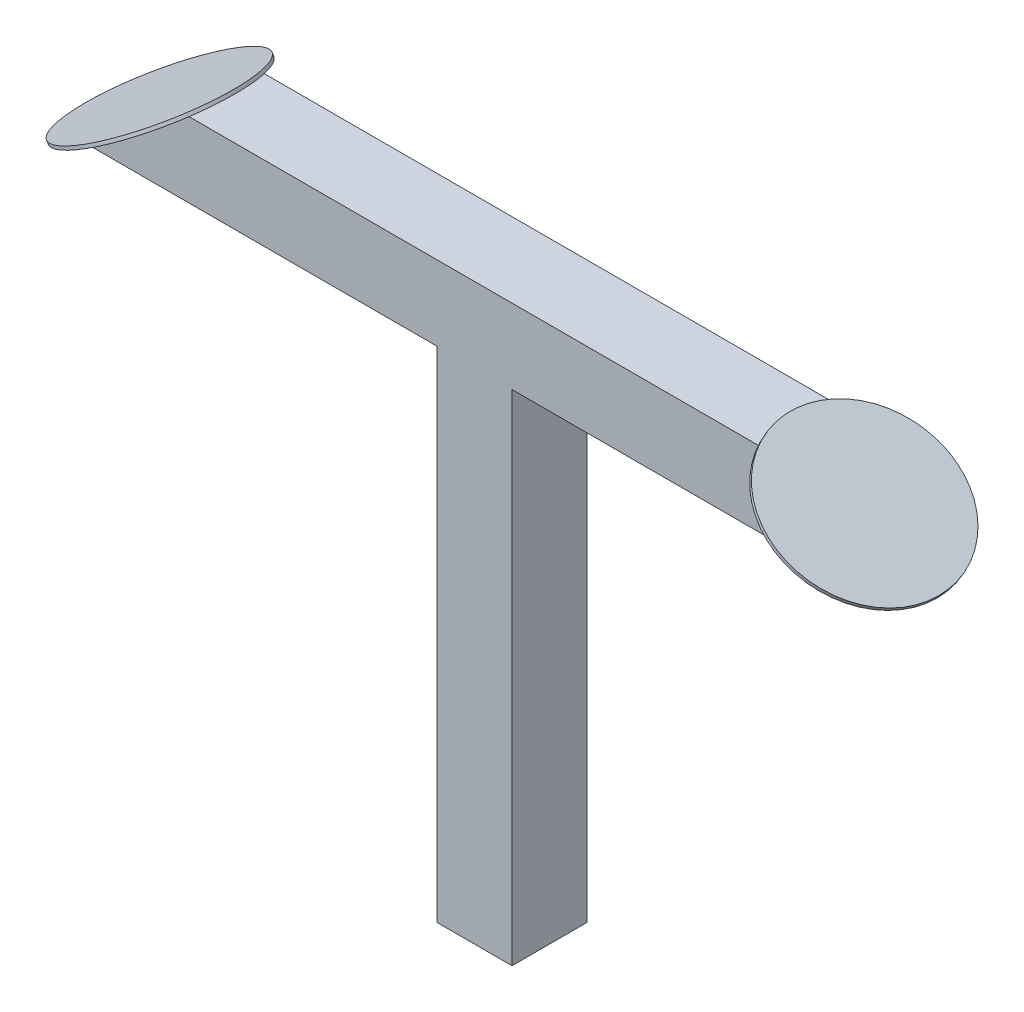
ISO-10303-21;
HEADER;
FILE_DESCRIPTION(('STEP AP214'),'2;1');
FILE_NAME('part.step','',(''),(''),'','','');
FILE_SCHEMA(('AUTOMOTIVE_DESIGN { 1 0 10303 214 1 1 1 1 }'));
ENDSEC;
DATA;
#1=APPLICATION_CONTEXT('core data for automotive mechanical design processes');
#2=APPLICATION_PROTOCOL_DEFINITION('international standard','automotive_design',2000,#1);
#3=PRODUCT_CONTEXT('',#1,'mechanical');
#4=PRODUCT('Part','Part','',(#3));
#5=PRODUCT_RELATED_PRODUCT_CATEGORY('part','',(#4));
#6=PRODUCT_DEFINITION_FORMATION('','',#4);
#7=PRODUCT_DEFINITION_CONTEXT('part definition',#1,'design');
#8=PRODUCT_DEFINITION('design','',#6,#7);
#9=PRODUCT_DEFINITION_SHAPE('','',#8);
#10=(LENGTH_UNIT() NAMED_UNIT(*) SI_UNIT(.MILLI.,.METRE.));
#11=(NAMED_UNIT(*) PLANE_ANGLE_UNIT() SI_UNIT($,.RADIAN.));
#12=(NAMED_UNIT(*) SI_UNIT($,.STERADIAN.) SOLID_ANGLE_UNIT());
#13=UNCERTAINTY_MEASURE_WITH_UNIT(LENGTH_MEASURE(1.E-05),#10,'distance_accuracy_value','');
#14=(GEOMETRIC_REPRESENTATION_CONTEXT(3) GLOBAL_UNCERTAINTY_ASSIGNED_CONTEXT((#13)) GLOBAL_UNIT_ASSIGNED_CONTEXT((#10,
#11,#12)) REPRESENTATION_CONTEXT('',''));
#15=CARTESIAN_POINT('',(0.,0.,0.));
#16=DIRECTION('',(0.,0.,1.));
#17=DIRECTION('',(1.,0.,0.));
#18=AXIS2_PLACEMENT_3D('',#15,#16,#17);
#19=CARTESIAN_POINT('',(-22.5,300.,-22.5));
#20=DIRECTION('',(0.,0.,1.));
#21=DIRECTION('',(1.,0.,0.));
#22=AXIS2_PLACEMENT_3D('',#19,#20,#21);
#23=PLANE('',#22);
#24=DIRECTION('',(-0.866025403784437,0.500000000000002,0.));
#25=VECTOR('',#24,1.);
#26=CARTESIAN_POINT('',(250.000000000001,300.,-22.5));
#27=LINE('',#26,#25);
#28=CARTESIAN_POINT('',(250.000000000001,300.,-22.5));
#29=VERTEX_POINT('',#28);
#30=CARTESIAN_POINT('',(172.057713659402,345.,-22.5));
#31=VERTEX_POINT('',#30);
#32=EDGE_CURVE('E336',#29,#31,#27,.T.);
#33=ORIENTED_EDGE('',*,*,#32,.F.);
#34=DIRECTION('',(-1.,0.,0.));
#35=VECTOR('',#34,1.);
#36=CARTESIAN_POINT('',(-250.000000000001,300.,-22.5));
#37=LINE('',#36,#35);
#38=CARTESIAN_POINT('',(22.5,300.,-22.5));
#39=VERTEX_POINT('',#38);
#40=EDGE_CURVE('E235',#29,#39,#37,.T.);
#41=ORIENTED_EDGE('',*,*,#40,.T.);
#42=DIRECTION('',(0.,-1.,0.));
#43=VECTOR('',#42,1.);
#44=CARTESIAN_POINT('',(22.5,300.,-22.5));
#45=LINE('',#44,#43);
#46=CARTESIAN_POINT('',(22.5,0.,-22.5));
#47=VERTEX_POINT('',#46);
#48=EDGE_CURVE('E279',#39,#47,#45,.T.);
#49=ORIENTED_EDGE('',*,*,#48,.T.);
#50=DIRECTION('',(-1.,0.,0.));
#51=VECTOR('',#50,1.);
#52=CARTESIAN_POINT('',(-22.5,0.,-22.5));
#53=LINE('',#52,#51);
#54=CARTESIAN_POINT('',(-22.5,0.,-22.5));
#55=VERTEX_POINT('',#54);
#56=EDGE_CURVE('E260',#47,#55,#53,.T.);
#57=ORIENTED_EDGE('',*,*,#56,.T.);
#58=DIRECTION('',(0.,-1.,0.));
#59=VECTOR('',#58,1.);
#60=CARTESIAN_POINT('',(-22.5,300.,-22.5));
#61=LINE('',#60,#59);
#62=CARTESIAN_POINT('',(-22.5,300.,-22.5));
#63=VERTEX_POINT('',#62);
#64=EDGE_CURVE('E275',#63,#55,#61,.T.);
#65=ORIENTED_EDGE('',*,*,#64,.F.);
#66=CARTESIAN_POINT('',(-250.000000000001,300.,-22.5));
#67=VERTEX_POINT('',#66);
#68=EDGE_CURVE('E234',#63,#67,#37,.T.);
#69=ORIENTED_EDGE('',*,*,#68,.T.);
#70=DIRECTION('',(0.866025403784437,0.500000000000002,0.));
#71=VECTOR('',#70,1.);
#72=CARTESIAN_POINT('',(-250.000000000001,300.,-22.5));
#73=LINE('',#72,#71);
#74=CARTESIAN_POINT('',(-172.057713659402,345.,-22.5));
#75=VERTEX_POINT('',#74);
#76=EDGE_CURVE('E317',#67,#75,#73,.T.);
#77=ORIENTED_EDGE('',*,*,#76,.T.);
#78=DIRECTION('',(-1.,0.,0.));
#79=VECTOR('',#78,1.);
#80=CARTESIAN_POINT('',(-250.000000000001,345.,-22.5));
#81=LINE('',#80,#79);
#82=EDGE_CURVE('E222',#31,#75,#81,.T.);
#83=ORIENTED_EDGE('',*,*,#82,.F.);
#84=EDGE_LOOP('',(#33,#41,#49,#57,#65,#69,#77,#83));
#85=FACE_BOUND('',#84,.T.);
#86=ADVANCED_FACE('F39',(#85),#23,.F.);
#87=CARTESIAN_POINT('',(-22.5,300.,22.5));
#88=DIRECTION('',(0.,0.,-1.));
#89=DIRECTION('',(-1.,0.,0.));
#90=AXIS2_PLACEMENT_3D('',#87,#88,#89);
#91=PLANE('',#90);
#92=DIRECTION('',(-0.866025403784437,0.500000000000002,0.));
#93=VECTOR('',#92,1.);
#94=CARTESIAN_POINT('',(250.000000000001,300.,22.5));
#95=LINE('',#94,#93);
#96=CARTESIAN_POINT('',(250.000000000001,300.,22.5));
#97=VERTEX_POINT('',#96);
#98=CARTESIAN_POINT('',(172.057713659402,345.,22.5));
#99=VERTEX_POINT('',#98);
#100=EDGE_CURVE('E337',#97,#99,#95,.T.);
#101=ORIENTED_EDGE('',*,*,#100,.T.);
#102=DIRECTION('',(1.,0.,0.));
#103=VECTOR('',#102,1.);
#104=CARTESIAN_POINT('',(-250.000000000001,345.,22.5));
#105=LINE('',#104,#103);
#106=CARTESIAN_POINT('',(-172.057713659402,345.,22.5));
#107=VERTEX_POINT('',#106);
#108=EDGE_CURVE('E225',#107,#99,#105,.T.);
#109=ORIENTED_EDGE('',*,*,#108,.F.);
#110=DIRECTION('',(0.866025403784437,0.500000000000002,0.));
#111=VECTOR('',#110,1.);
#112=CARTESIAN_POINT('',(-250.000000000001,300.,22.5));
#113=LINE('',#112,#111);
#114=CARTESIAN_POINT('',(-250.000000000001,300.,22.5));
#115=VERTEX_POINT('',#114);
#116=EDGE_CURVE('E318',#115,#107,#113,.T.);
#117=ORIENTED_EDGE('',*,*,#116,.F.);
#118=DIRECTION('',(1.,0.,0.));
#119=VECTOR('',#118,1.);
#120=CARTESIAN_POINT('',(-250.000000000001,300.,22.5));
#121=LINE('',#120,#119);
#122=CARTESIAN_POINT('',(-22.5,300.,22.5));
#123=VERTEX_POINT('',#122);
#124=EDGE_CURVE('E226',#115,#123,#121,.T.);
#125=ORIENTED_EDGE('',*,*,#124,.T.);
#126=DIRECTION('',(0.,-1.,0.));
#127=VECTOR('',#126,1.);
#128=CARTESIAN_POINT('',(-22.5,300.,22.5));
#129=LINE('',#128,#127);
#130=CARTESIAN_POINT('',(-22.5,0.,22.5));
#131=VERTEX_POINT('',#130);
#132=EDGE_CURVE('E271',#123,#131,#129,.T.);
#133=ORIENTED_EDGE('',*,*,#132,.T.);
#134=DIRECTION('',(1.,0.,0.));
#135=VECTOR('',#134,1.);
#136=CARTESIAN_POINT('',(-22.5,0.,22.5));
#137=LINE('',#136,#135);
#138=CARTESIAN_POINT('',(22.5,0.,22.5));
#139=VERTEX_POINT('',#138);
#140=EDGE_CURVE('E252',#131,#139,#137,.T.);
#141=ORIENTED_EDGE('',*,*,#140,.T.);
#142=DIRECTION('',(0.,-1.,0.));
#143=VECTOR('',#142,1.);
#144=CARTESIAN_POINT('',(22.5,300.,22.5));
#145=LINE('',#144,#143);
#146=CARTESIAN_POINT('',(22.5,300.,22.5));
#147=VERTEX_POINT('',#146);
#148=EDGE_CURVE('E256',#147,#139,#145,.T.);
#149=ORIENTED_EDGE('',*,*,#148,.F.);
#150=EDGE_CURVE('E243',#147,#97,#121,.T.);
#151=ORIENTED_EDGE('',*,*,#150,.T.);
#152=EDGE_LOOP('',(#101,#109,#117,#125,#133,#141,#149,#151));
#153=FACE_BOUND('',#152,.T.);
#154=ADVANCED_FACE('F368',(#153),#91,.F.);
#155=CARTESIAN_POINT('',(0.,345.,0.));
#156=DIRECTION('',(0.,-1.,0.));
#157=DIRECTION('',(0.,0.,-1.));
#158=AXIS2_PLACEMENT_3D('',#155,#156,#157);
#159=PLANE('',#158);
#160=DIRECTION('',(0.,0.,1.));
#161=VECTOR('',#160,1.);
#162=CARTESIAN_POINT('',(172.057713659402,345.,-22.5));
#163=LINE('',#162,#161);
#164=EDGE_CURVE('E55',#31,#99,#163,.T.);
#165=ORIENTED_EDGE('',*,*,#164,.F.);
#166=ORIENTED_EDGE('',*,*,#82,.T.);
#167=DIRECTION('',(0.,0.,1.));
#168=VECTOR('',#167,1.);
#169=CARTESIAN_POINT('',(-172.057713659402,345.,-22.5));
#170=LINE('',#169,#168);
#171=EDGE_CURVE('E312',#75,#107,#170,.T.);
#172=ORIENTED_EDGE('',*,*,#171,.T.);
#173=ORIENTED_EDGE('',*,*,#108,.T.);
#174=EDGE_LOOP('',(#165,#166,#172,#173));
#175=FACE_BOUND('',#174,.T.);
#176=ADVANCED_FACE('F373',(#175),#159,.F.);
#177=CARTESIAN_POINT('',(-22.5,300.,-17.5));
#178=DIRECTION('',(0.,0.,1.));
#179=DIRECTION('',(1.,0.,0.));
#180=AXIS2_PLACEMENT_3D('',#177,#178,#179);
#181=PLANE('',#180);
#182=DIRECTION('',(-1.,0.,0.));
#183=VECTOR('',#182,1.);
#184=CARTESIAN_POINT('',(0.,305.,-17.5));
#185=LINE('',#184,#183);
#186=CARTESIAN_POINT('',(241.339745962156,305.,-17.5));
#187=VERTEX_POINT('',#186);
#188=CARTESIAN_POINT('',(17.5,305.,-17.5));
#189=VERTEX_POINT('',#188);
#190=EDGE_CURVE('E167',#187,#189,#185,.T.);
#191=ORIENTED_EDGE('',*,*,#190,.F.);
#192=DIRECTION('',(-0.866025403784438,0.500000000000002,0.));
#193=VECTOR('',#192,1.);
#194=CARTESIAN_POINT('',(45.6250000000007,417.99596126563,-17.5));
#195=LINE('',#194,#193);
#196=CARTESIAN_POINT('',(180.717967697246,340.,-17.5));
#197=VERTEX_POINT('',#196);
#198=EDGE_CURVE('E152',#187,#197,#195,.T.);
#199=ORIENTED_EDGE('',*,*,#198,.T.);
#200=DIRECTION('',(-1.,0.,0.));
#201=VECTOR('',#200,1.);
#202=CARTESIAN_POINT('',(0.,340.,-17.5));
#203=LINE('',#202,#201);
#204=CARTESIAN_POINT('',(-180.717967697246,340.,-17.5));
#205=VERTEX_POINT('',#204);
#206=EDGE_CURVE('E189',#197,#205,#203,.T.);
#207=ORIENTED_EDGE('',*,*,#206,.T.);
#208=DIRECTION('',(0.866025403784438,0.500000000000002,0.));
#209=VECTOR('',#208,1.);
#210=CARTESIAN_POINT('',(-79.3750000000006,398.51038968048,-17.5));
#211=LINE('',#210,#209);
#212=CARTESIAN_POINT('',(-241.339745962156,305.,-17.5));
#213=VERTEX_POINT('',#212);
#214=EDGE_CURVE('E298',#213,#205,#211,.T.);
#215=ORIENTED_EDGE('',*,*,#214,.F.);
#216=DIRECTION('',(-1.,0.,0.));
#217=VECTOR('',#216,1.);
#218=CARTESIAN_POINT('',(0.,305.,-17.5));
#219=LINE('',#218,#217);
#220=CARTESIAN_POINT('',(-17.5,305.,-17.5));
#221=VERTEX_POINT('',#220);
#222=EDGE_CURVE('E179',#221,#213,#219,.T.);
#223=ORIENTED_EDGE('',*,*,#222,.F.);
#224=DIRECTION('',(0.,-1.,0.));
#225=VECTOR('',#224,1.);
#226=CARTESIAN_POINT('',(-17.5,300.,-17.5));
#227=LINE('',#226,#225);
#228=CARTESIAN_POINT('',(-17.5,0.,-17.5));
#229=VERTEX_POINT('',#228);
#230=EDGE_CURVE('E193',#221,#229,#227,.T.);
#231=ORIENTED_EDGE('',*,*,#230,.T.);
#232=DIRECTION('',(-1.,0.,0.));
#233=VECTOR('',#232,1.);
#234=CARTESIAN_POINT('',(0.,0.,-17.5));
#235=LINE('',#234,#233);
#236=CARTESIAN_POINT('',(17.5,0.,-17.5));
#237=VERTEX_POINT('',#236);
#238=EDGE_CURVE('E210',#237,#229,#235,.T.);
#239=ORIENTED_EDGE('',*,*,#238,.F.);
#240=DIRECTION('',(0.,-1.,0.));
#241=VECTOR('',#240,1.);
#242=CARTESIAN_POINT('',(17.5,300.,-17.5));
#243=LINE('',#242,#241);
#244=EDGE_CURVE('E176',#189,#237,#243,.T.);
#245=ORIENTED_EDGE('',*,*,#244,.F.);
#246=EDGE_LOOP('',(#191,#199,#207,#215,#223,#231,#239,#245));
#247=FACE_BOUND('',#246,.T.);
#248=ADVANCED_FACE('F174',(#247),#181,.T.);
#249=CARTESIAN_POINT('',(-22.5,300.,17.5));
#250=DIRECTION('',(0.,0.,-1.));
#251=DIRECTION('',(-1.,0.,0.));
#252=AXIS2_PLACEMENT_3D('',#249,#250,#251);
#253=PLANE('',#252);
#254=DIRECTION('',(1.,0.,0.));
#255=VECTOR('',#254,1.);
#256=CARTESIAN_POINT('',(0.,340.,17.5));
#257=LINE('',#256,#255);
#258=CARTESIAN_POINT('',(-180.717967697246,340.,17.5));
#259=VERTEX_POINT('',#258);
#260=CARTESIAN_POINT('',(180.717967697246,340.,17.5));
#261=VERTEX_POINT('',#260);
#262=EDGE_CURVE('E200',#259,#261,#257,.T.);
#263=ORIENTED_EDGE('',*,*,#262,.T.);
#264=DIRECTION('',(0.866025403784438,-0.500000000000002,0.));
#265=VECTOR('',#264,1.);
#266=CARTESIAN_POINT('',(45.6250000000007,417.99596126563,17.5));
#267=LINE('',#266,#265);
#268=CARTESIAN_POINT('',(241.339745962156,305.,17.5));
#269=VERTEX_POINT('',#268);
#270=EDGE_CURVE('E161',#261,#269,#267,.T.);
#271=ORIENTED_EDGE('',*,*,#270,.T.);
#272=DIRECTION('',(1.,0.,0.));
#273=VECTOR('',#272,1.);
#274=CARTESIAN_POINT('',(0.,305.,17.5));
#275=LINE('',#274,#273);
#276=CARTESIAN_POINT('',(17.5,305.,17.5));
#277=VERTEX_POINT('',#276);
#278=EDGE_CURVE('E170',#277,#269,#275,.T.);
#279=ORIENTED_EDGE('',*,*,#278,.F.);
#280=DIRECTION('',(0.,-1.,0.));
#281=VECTOR('',#280,1.);
#282=CARTESIAN_POINT('',(17.5,300.,17.5));
#283=LINE('',#282,#281);
#284=CARTESIAN_POINT('',(17.5,0.,17.5));
#285=VERTEX_POINT('',#284);
#286=EDGE_CURVE('E194',#277,#285,#283,.T.);
#287=ORIENTED_EDGE('',*,*,#286,.T.);
#288=DIRECTION('',(1.,0.,0.));
#289=VECTOR('',#288,1.);
#290=CARTESIAN_POINT('',(0.,0.,17.5));
#291=LINE('',#290,#289);
#292=CARTESIAN_POINT('',(-17.5,0.,17.5));
#293=VERTEX_POINT('',#292);
#294=EDGE_CURVE('E211',#293,#285,#291,.T.);
#295=ORIENTED_EDGE('',*,*,#294,.F.);
#296=DIRECTION('',(0.,-1.,0.));
#297=VECTOR('',#296,1.);
#298=CARTESIAN_POINT('',(-17.5,300.,17.5));
#299=LINE('',#298,#297);
#300=CARTESIAN_POINT('',(-17.5,305.,17.5));
#301=VERTEX_POINT('',#300);
#302=EDGE_CURVE('E190',#301,#293,#299,.T.);
#303=ORIENTED_EDGE('',*,*,#302,.F.);
#304=DIRECTION('',(1.,0.,0.));
#305=VECTOR('',#304,1.);
#306=CARTESIAN_POINT('',(0.,305.,17.5));
#307=LINE('',#306,#305);
#308=CARTESIAN_POINT('',(-241.339745962156,305.,17.5));
#309=VERTEX_POINT('',#308);
#310=EDGE_CURVE('E183',#309,#301,#307,.T.);
#311=ORIENTED_EDGE('',*,*,#310,.F.);
#312=DIRECTION('',(-0.866025403784438,-0.500000000000002,0.));
#313=VECTOR('',#312,1.);
#314=CARTESIAN_POINT('',(-79.3750000000006,398.51038968048,17.5));
#315=LINE('',#314,#313);
#316=EDGE_CURVE('E309',#259,#309,#315,.T.);
#317=ORIENTED_EDGE('',*,*,#316,.F.);
#318=EDGE_LOOP('',(#263,#271,#279,#287,#295,#303,#311,#317));
#319=FACE_BOUND('',#318,.T.);
#320=ADVANCED_FACE('F397',(#319),#253,.T.);
#321=CARTESIAN_POINT('',(0.,305.,0.));
#322=DIRECTION('',(0.,-1.,0.));
#323=DIRECTION('',(0.,0.,-1.));
#324=AXIS2_PLACEMENT_3D('',#321,#322,#323);
#325=PLANE('',#324);
#326=DIRECTION('',(0.,0.,1.));
#327=VECTOR('',#326,1.);
#328=CARTESIAN_POINT('',(241.339745962156,305.,0.));
#329=LINE('',#328,#327);
#330=EDGE_CURVE('E155',#187,#269,#329,.T.);
#331=ORIENTED_EDGE('',*,*,#330,.F.);
#332=ORIENTED_EDGE('',*,*,#190,.T.);
#333=DIRECTION('',(0.,0.,-1.));
#334=VECTOR('',#333,1.);
#335=CARTESIAN_POINT('',(17.5,305.,0.));
#336=LINE('',#335,#334);
#337=EDGE_CURVE('E198',#277,#189,#336,.T.);
#338=ORIENTED_EDGE('',*,*,#337,.F.);
#339=ORIENTED_EDGE('',*,*,#278,.T.);
#340=EDGE_LOOP('',(#331,#332,#338,#339));
#341=FACE_BOUND('',#340,.T.);
#342=ADVANCED_FACE('F165',(#341),#325,.F.);
#343=CARTESIAN_POINT('',(0.,340.,0.));
#344=DIRECTION('',(0.,-1.,0.));
#345=DIRECTION('',(0.,0.,-1.));
#346=AXIS2_PLACEMENT_3D('',#343,#344,#345);
#347=PLANE('',#346);
#348=ORIENTED_EDGE('',*,*,#206,.F.);
#349=DIRECTION('',(0.,0.,1.));
#350=VECTOR('',#349,1.);
#351=CARTESIAN_POINT('',(180.717967697246,340.,0.));
#352=LINE('',#351,#350);
#353=EDGE_CURVE('E11',#197,#261,#352,.T.);
#354=ORIENTED_EDGE('',*,*,#353,.T.);
#355=ORIENTED_EDGE('',*,*,#262,.F.);
#356=DIRECTION('',(0.,0.,1.));
#357=VECTOR('',#356,1.);
#358=CARTESIAN_POINT('',(-180.717967697246,340.,0.));
#359=LINE('',#358,#357);
#360=EDGE_CURVE('E185',#205,#259,#359,.T.);
#361=ORIENTED_EDGE('',*,*,#360,.F.);
#362=EDGE_LOOP('',(#348,#354,#355,#361));
#363=FACE_BOUND('',#362,.T.);
#364=ADVANCED_FACE('F302',(#363),#347,.T.);
#365=CARTESIAN_POINT('',(0.,0.,0.));
#366=DIRECTION('',(0.,-1.,0.));
#367=DIRECTION('',(0.,0.,-1.));
#368=AXIS2_PLACEMENT_3D('',#365,#366,#367);
#369=PLANE('',#368);
#370=DIRECTION('',(0.,0.,-1.));
#371=VECTOR('',#370,1.);
#372=CARTESIAN_POINT('',(22.5,0.,22.5));
#373=LINE('',#372,#371);
#374=EDGE_CURVE('E229',#139,#47,#373,.T.);
#375=ORIENTED_EDGE('',*,*,#374,.F.);
#376=ORIENTED_EDGE('',*,*,#140,.F.);
#377=DIRECTION('',(0.,0.,1.));
#378=VECTOR('',#377,1.);
#379=CARTESIAN_POINT('',(-22.5,0.,22.5));
#380=LINE('',#379,#378);
#381=EDGE_CURVE('E263',#55,#131,#380,.T.);
#382=ORIENTED_EDGE('',*,*,#381,.F.);
#383=ORIENTED_EDGE('',*,*,#56,.F.);
#384=EDGE_LOOP('',(#375,#376,#382,#383));
#385=FACE_BOUND('',#384,.T.);
#386=ORIENTED_EDGE('',*,*,#294,.T.);
#387=DIRECTION('',(0.,0.,-1.));
#388=VECTOR('',#387,1.);
#389=CARTESIAN_POINT('',(17.5,0.,0.));
#390=LINE('',#389,#388);
#391=EDGE_CURVE('E204',#285,#237,#390,.T.);
#392=ORIENTED_EDGE('',*,*,#391,.T.);
#393=ORIENTED_EDGE('',*,*,#238,.T.);
#394=DIRECTION('',(0.,0.,1.));
#395=VECTOR('',#394,1.);
#396=CARTESIAN_POINT('',(-17.5,0.,0.));
#397=LINE('',#396,#395);
#398=EDGE_CURVE('E215',#229,#293,#397,.T.);
#399=ORIENTED_EDGE('',*,*,#398,.T.);
#400=EDGE_LOOP('',(#386,#392,#393,#399));
#401=FACE_BOUND('',#400,.T.);
#402=ADVANCED_FACE('F382',(#385,#401),#369,.T.);
#403=CARTESIAN_POINT('',(22.5,300.,22.5));
#404=DIRECTION('',(-1.,0.,0.));
#405=DIRECTION('',(0.,0.,1.));
#406=AXIS2_PLACEMENT_3D('',#403,#404,#405);
#407=PLANE('',#406);
#408=ORIENTED_EDGE('',*,*,#374,.T.);
#409=ORIENTED_EDGE('',*,*,#48,.F.);
#410=DIRECTION('',(0.,0.,-1.));
#411=VECTOR('',#410,1.);
#412=CARTESIAN_POINT('',(22.5,300.,22.5));
#413=LINE('',#412,#411);
#414=EDGE_CURVE('E247',#147,#39,#413,.T.);
#415=ORIENTED_EDGE('',*,*,#414,.F.);
#416=ORIENTED_EDGE('',*,*,#148,.T.);
#417=EDGE_LOOP('',(#408,#409,#415,#416));
#418=FACE_BOUND('',#417,.T.);
#419=ADVANCED_FACE('F41',(#418),#407,.F.);
#420=CARTESIAN_POINT('',(-22.5,300.,22.5));
#421=DIRECTION('',(1.,0.,0.));
#422=DIRECTION('',(0.,0.,-1.));
#423=AXIS2_PLACEMENT_3D('',#420,#421,#422);
#424=PLANE('',#423);
#425=ORIENTED_EDGE('',*,*,#381,.T.);
#426=ORIENTED_EDGE('',*,*,#132,.F.);
#427=DIRECTION('',(0.,0.,1.));
#428=VECTOR('',#427,1.);
#429=CARTESIAN_POINT('',(-22.5,300.,22.5));
#430=LINE('',#429,#428);
#431=EDGE_CURVE('E251',#63,#123,#430,.T.);
#432=ORIENTED_EDGE('',*,*,#431,.F.);
#433=ORIENTED_EDGE('',*,*,#64,.T.);
#434=EDGE_LOOP('',(#425,#426,#432,#433));
#435=FACE_BOUND('',#434,.T.);
#436=ADVANCED_FACE('F377',(#435),#424,.F.);
#437=CARTESIAN_POINT('',(0.,300.,0.));
#438=DIRECTION('',(0.,-1.,0.));
#439=DIRECTION('',(0.,0.,-1.));
#440=AXIS2_PLACEMENT_3D('',#437,#438,#439);
#441=PLANE('',#440);
#442=ORIENTED_EDGE('',*,*,#150,.F.);
#443=ORIENTED_EDGE('',*,*,#414,.T.);
#444=ORIENTED_EDGE('',*,*,#40,.F.);
#445=DIRECTION('',(0.,0.,-1.));
#446=VECTOR('',#445,1.);
#447=CARTESIAN_POINT('',(249.999999999999,300.,22.5));
#448=LINE('',#447,#446);
#449=EDGE_CURVE('E230',#97,#29,#448,.T.);
#450=ORIENTED_EDGE('',*,*,#449,.F.);
#451=EDGE_LOOP('',(#442,#443,#444,#450));
#452=FACE_BOUND('',#451,.T.);
#453=ADVANCED_FACE('F379',(#452),#441,.T.);
#454=ORIENTED_EDGE('',*,*,#68,.F.);
#455=ORIENTED_EDGE('',*,*,#431,.T.);
#456=ORIENTED_EDGE('',*,*,#124,.F.);
#457=DIRECTION('',(0.,0.,1.));
#458=VECTOR('',#457,1.);
#459=CARTESIAN_POINT('',(-250.000000000001,300.,22.5));
#460=LINE('',#459,#458);
#461=EDGE_CURVE('E239',#67,#115,#460,.T.);
#462=ORIENTED_EDGE('',*,*,#461,.F.);
#463=EDGE_LOOP('',(#454,#455,#456,#462));
#464=FACE_BOUND('',#463,.T.);
#465=ADVANCED_FACE('F386',(#464),#441,.T.);
#466=CARTESIAN_POINT('',(17.5,300.,22.5));
#467=DIRECTION('',(-1.,0.,0.));
#468=DIRECTION('',(0.,0.,1.));
#469=AXIS2_PLACEMENT_3D('',#466,#467,#468);
#470=PLANE('',#469);
#471=ORIENTED_EDGE('',*,*,#391,.F.);
#472=ORIENTED_EDGE('',*,*,#286,.F.);
#473=ORIENTED_EDGE('',*,*,#337,.T.);
#474=ORIENTED_EDGE('',*,*,#244,.T.);
#475=EDGE_LOOP('',(#471,#472,#473,#474));
#476=FACE_BOUND('',#475,.T.);
#477=ADVANCED_FACE('F389',(#476),#470,.T.);
#478=CARTESIAN_POINT('',(-17.5,300.,22.5));
#479=DIRECTION('',(1.,0.,0.));
#480=DIRECTION('',(0.,0.,-1.));
#481=AXIS2_PLACEMENT_3D('',#478,#479,#480);
#482=PLANE('',#481);
#483=ORIENTED_EDGE('',*,*,#398,.F.);
#484=ORIENTED_EDGE('',*,*,#230,.F.);
#485=DIRECTION('',(0.,0.,1.));
#486=VECTOR('',#485,1.);
#487=CARTESIAN_POINT('',(-17.5,305.,0.));
#488=LINE('',#487,#486);
#489=EDGE_CURVE('E195',#221,#301,#488,.T.);
#490=ORIENTED_EDGE('',*,*,#489,.T.);
#491=ORIENTED_EDGE('',*,*,#302,.T.);
#492=EDGE_LOOP('',(#483,#484,#490,#491));
#493=FACE_BOUND('',#492,.T.);
#494=ADVANCED_FACE('F402',(#493),#482,.T.);
#495=ORIENTED_EDGE('',*,*,#222,.T.);
#496=DIRECTION('',(0.,0.,1.));
#497=VECTOR('',#496,1.);
#498=CARTESIAN_POINT('',(-241.339745962156,305.,0.));
#499=LINE('',#498,#497);
#500=EDGE_CURVE('E48',#213,#309,#499,.T.);
#501=ORIENTED_EDGE('',*,*,#500,.T.);
#502=ORIENTED_EDGE('',*,*,#310,.T.);
#503=ORIENTED_EDGE('',*,*,#489,.F.);
#504=EDGE_LOOP('',(#495,#501,#502,#503));
#505=FACE_BOUND('',#504,.T.);
#506=ADVANCED_FACE('F398',(#505),#325,.F.);
#507=CARTESIAN_POINT('',(-212.028856829701,324.232050807569,0.));
#508=DIRECTION('',(-0.500000000000002,0.866025403784437,0.));
#509=DIRECTION('',(-0.866025403784438,-0.500000000000002,0.));
#510=AXIS2_PLACEMENT_3D('',#507,#508,#509);
#511=PLANE('',#510);
#512=CARTESIAN_POINT('',(-212.028856829701,324.232050807569,0.));
#513=DIRECTION('',(-0.500000000000002,0.866025403784437,0.));
#514=DIRECTION('',(-0.866025403784438,-0.500000000000002,0.));
#515=AXIS2_PLACEMENT_3D('',#512,#513,#514);
#516=CIRCLE('',#515,51.5);
#517=CARTESIAN_POINT('',(-256.6291651246,298.482050807569,0.));
#518=VERTEX_POINT('',#517);
#519=EDGE_CURVE('E322',#518,#518,#516,.T.);
#520=ORIENTED_EDGE('',*,*,#519,.T.);
#521=EDGE_LOOP('',(#520));
#522=FACE_BOUND('',#521,.T.);
#523=ADVANCED_FACE('F415',(#522),#511,.T.);
#524=CARTESIAN_POINT('',(-212.028856829701,324.232050807569,0.));
#525=DIRECTION('',(0.500000000000002,-0.866025403784438,0.));
#526=DIRECTION('',(0.866025403784437,0.500000000000002,0.));
#527=AXIS2_PLACEMENT_3D('',#524,#525,#526);
#528=CYLINDRICAL_SURFACE('',#527,51.5);
#529=ORIENTED_EDGE('',*,*,#519,.F.);
#530=EDGE_LOOP('',(#529));
#531=FACE_BOUND('',#530,.T.);
#532=CARTESIAN_POINT('',(-211.028856829701,322.5,0.));
#533=DIRECTION('',(-0.500000000000002,0.866025403784437,0.));
#534=DIRECTION('',(-0.866025403784438,-0.500000000000002,0.));
#535=AXIS2_PLACEMENT_3D('',#532,#533,#534);
#536=CIRCLE('',#535,51.5);
#537=CARTESIAN_POINT('',(-255.6291651246,296.75,0.));
#538=VERTEX_POINT('',#537);
#539=EDGE_CURVE('E172',#538,#538,#536,.T.);
#540=ORIENTED_EDGE('',*,*,#539,.T.);
#541=EDGE_LOOP('',(#540));
#542=FACE_BOUND('',#541,.T.);
#543=ADVANCED_FACE('F411',(#531,#542),#528,.T.);
#544=CARTESIAN_POINT('',(-211.028856829701,322.5,0.));
#545=DIRECTION('',(-0.500000000000002,0.866025403784437,0.));
#546=DIRECTION('',(-0.866025403784438,-0.500000000000002,0.));
#547=AXIS2_PLACEMENT_3D('',#544,#545,#546);
#548=PLANE('',#547);
#549=ORIENTED_EDGE('',*,*,#539,.F.);
#550=EDGE_LOOP('',(#549));
#551=FACE_BOUND('',#550,.T.);
#552=ORIENTED_EDGE('',*,*,#461,.T.);
#553=ORIENTED_EDGE('',*,*,#116,.T.);
#554=ORIENTED_EDGE('',*,*,#171,.F.);
#555=ORIENTED_EDGE('',*,*,#76,.F.);
#556=EDGE_LOOP('',(#552,#553,#554,#555));
#557=FACE_BOUND('',#556,.T.);
#558=ADVANCED_FACE('F414',(#551,#557),#548,.F.);
#559=ORIENTED_EDGE('',*,*,#214,.T.);
#560=ORIENTED_EDGE('',*,*,#360,.T.);
#561=ORIENTED_EDGE('',*,*,#316,.T.);
#562=ORIENTED_EDGE('',*,*,#500,.F.);
#563=EDGE_LOOP('',(#559,#560,#561,#562));
#564=FACE_BOUND('',#563,.T.);
#565=ADVANCED_FACE('F307',(#564),#548,.F.);
#566=CARTESIAN_POINT('',(211.028856829701,322.5,0.));
#567=DIRECTION('',(0.500000000000002,0.866025403784437,0.));
#568=DIRECTION('',(0.866025403784438,-0.500000000000002,0.));
#569=AXIS2_PLACEMENT_3D('',#566,#567,#568);
#570=PLANE('',#569);
#571=ORIENTED_EDGE('',*,*,#198,.F.);
#572=ORIENTED_EDGE('',*,*,#330,.T.);
#573=ORIENTED_EDGE('',*,*,#270,.F.);
#574=ORIENTED_EDGE('',*,*,#353,.F.);
#575=EDGE_LOOP('',(#571,#572,#573,#574));
#576=FACE_BOUND('',#575,.T.);
#577=ADVANCED_FACE('F154',(#576),#570,.F.);
#578=CARTESIAN_POINT('',(212.028856829701,324.232050807569,0.));
#579=DIRECTION('',(-0.500000000000002,-0.866025403784438,0.));
#580=DIRECTION('',(0.866025403784437,-0.500000000000002,0.));
#581=AXIS2_PLACEMENT_3D('',#578,#579,#580);
#582=CYLINDRICAL_SURFACE('',#581,51.5);
#583=CARTESIAN_POINT('',(212.028856829701,324.232050807569,0.));
#584=DIRECTION('',(-0.500000000000002,-0.866025403784437,0.));
#585=DIRECTION('',(0.866025403784438,-0.500000000000002,0.));
#586=AXIS2_PLACEMENT_3D('',#583,#584,#585);
#587=CIRCLE('',#586,51.5);
#588=CARTESIAN_POINT('',(256.6291651246,298.482050807569,0.));
#589=VERTEX_POINT('',#588);
#590=EDGE_CURVE('E341',#589,#589,#587,.T.);
#591=ORIENTED_EDGE('',*,*,#590,.T.);
#592=EDGE_LOOP('',(#591));
#593=FACE_BOUND('',#592,.T.);
#594=CARTESIAN_POINT('',(211.028856829701,322.5,0.));
#595=DIRECTION('',(-0.500000000000002,-0.866025403784437,0.));
#596=DIRECTION('',(0.866025403784438,-0.500000000000002,0.));
#597=AXIS2_PLACEMENT_3D('',#594,#595,#596);
#598=CIRCLE('',#597,51.5);
#599=CARTESIAN_POINT('',(255.6291651246,296.75,0.));
#600=VERTEX_POINT('',#599);
#601=EDGE_CURVE('E345',#600,#600,#598,.T.);
#602=ORIENTED_EDGE('',*,*,#601,.F.);
#603=EDGE_LOOP('',(#602));
#604=FACE_BOUND('',#603,.T.);
#605=ADVANCED_FACE('F353',(#593,#604),#582,.T.);
#606=CARTESIAN_POINT('',(212.028856829701,324.232050807569,0.));
#607=DIRECTION('',(0.500000000000002,0.866025403784437,0.));
#608=DIRECTION('',(0.866025403784438,-0.500000000000002,0.));
#609=AXIS2_PLACEMENT_3D('',#606,#607,#608);
#610=PLANE('',#609);
#611=ORIENTED_EDGE('',*,*,#590,.F.);
#612=EDGE_LOOP('',(#611));
#613=FACE_BOUND('',#612,.T.);
#614=ADVANCED_FACE('F356',(#613),#610,.T.);
#615=ORIENTED_EDGE('',*,*,#100,.F.);
#616=ORIENTED_EDGE('',*,*,#449,.T.);
#617=ORIENTED_EDGE('',*,*,#32,.T.);
#618=ORIENTED_EDGE('',*,*,#164,.T.);
#619=EDGE_LOOP('',(#615,#616,#617,#618));
#620=FACE_BOUND('',#619,.T.);
#621=ORIENTED_EDGE('',*,*,#601,.T.);
#622=EDGE_LOOP('',(#621));
#623=FACE_BOUND('',#622,.T.);
#624=ADVANCED_FACE('F358',(#620,#623),#570,.F.);
#625=CLOSED_SHELL('',(#86,#154,#176,#248,#320,#342,#364,#402,#419,#436,#453,#465,#477,#494,#506,
#523,#543,#558,#565,#577,#605,#614,#624));
#626=MANIFOLD_SOLID_BREP('B2',#625);
#627=ADVANCED_BREP_SHAPE_REPRESENTATION('',(#18,#626),#14);
#628=SHAPE_DEFINITION_REPRESENTATION(#9,#627);
ENDSEC;
END-ISO-10303-21;
